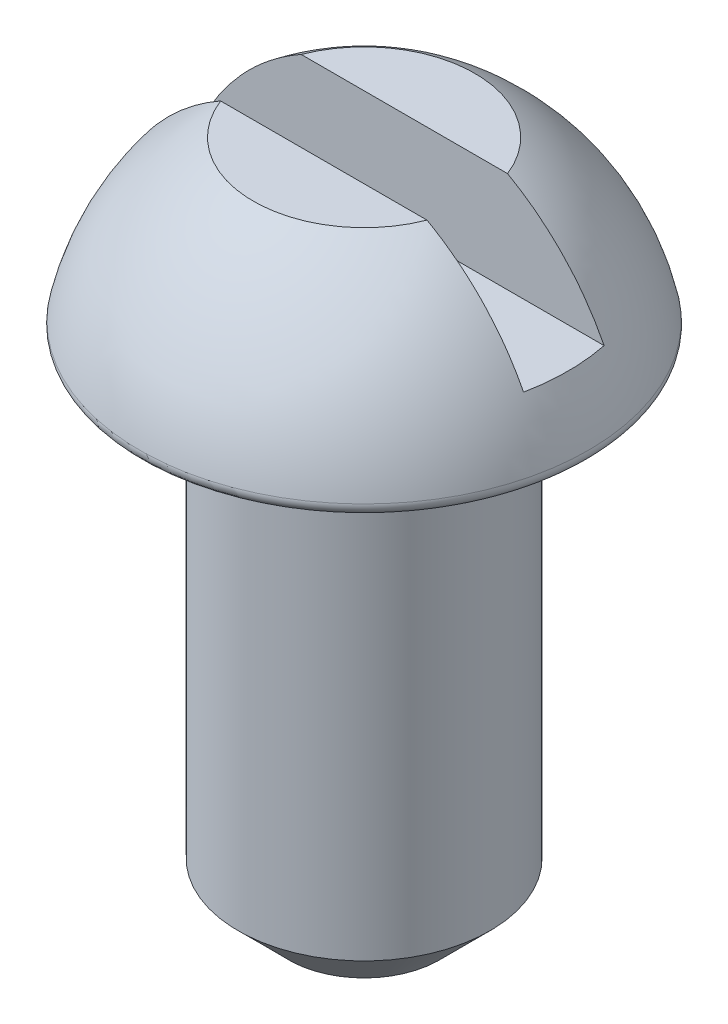
ISO-10303-21;
HEADER;
FILE_DESCRIPTION(('STEP AP214'),'2;1');
FILE_NAME('part.step','',(''),(''),'','','');
FILE_SCHEMA(('AUTOMOTIVE_DESIGN { 1 0 10303 214 1 1 1 1 }'));
ENDSEC;
DATA;
#1=APPLICATION_CONTEXT('core data for automotive mechanical design processes');
#2=APPLICATION_PROTOCOL_DEFINITION('international standard','automotive_design',2000,#1);
#3=PRODUCT_CONTEXT('',#1,'mechanical');
#4=PRODUCT('Part','Part','',(#3));
#5=PRODUCT_RELATED_PRODUCT_CATEGORY('part','',(#4));
#6=PRODUCT_DEFINITION_FORMATION('','',#4);
#7=PRODUCT_DEFINITION_CONTEXT('part definition',#1,'design');
#8=PRODUCT_DEFINITION('design','',#6,#7);
#9=PRODUCT_DEFINITION_SHAPE('','',#8);
#10=(LENGTH_UNIT() NAMED_UNIT(*) SI_UNIT(.MILLI.,.METRE.));
#11=(NAMED_UNIT(*) PLANE_ANGLE_UNIT() SI_UNIT($,.RADIAN.));
#12=(NAMED_UNIT(*) SI_UNIT($,.STERADIAN.) SOLID_ANGLE_UNIT());
#13=UNCERTAINTY_MEASURE_WITH_UNIT(LENGTH_MEASURE(1.E-05),#10,'distance_accuracy_value','');
#14=(GEOMETRIC_REPRESENTATION_CONTEXT(3) GLOBAL_UNCERTAINTY_ASSIGNED_CONTEXT((#13)) GLOBAL_UNIT_ASSIGNED_CONTEXT((#10,
#11,#12)) REPRESENTATION_CONTEXT('',''));
#15=CARTESIAN_POINT('',(0.,0.,0.));
#16=DIRECTION('',(0.,0.,1.));
#17=DIRECTION('',(1.,0.,0.));
#18=AXIS2_PLACEMENT_3D('',#15,#16,#17);
#19=CARTESIAN_POINT('',(0.,6.7,0.));
#20=DIRECTION('',(0.,1.,0.));
#21=DIRECTION('',(0.,0.,1.));
#22=AXIS2_PLACEMENT_3D('',#19,#20,#21);
#23=PLANE('',#22);
#24=DIRECTION('',(-1.,0.,0.));
#25=VECTOR('',#24,1.);
#26=CARTESIAN_POINT('',(-2.5,6.7,-0.4));
#27=LINE('',#26,#25);
#28=CARTESIAN_POINT('',(1.02469507659596,6.7,-0.4));
#29=VERTEX_POINT('',#28);
#30=CARTESIAN_POINT('',(-1.02469507659596,6.7,-0.4));
#31=VERTEX_POINT('',#30);
#32=EDGE_CURVE('E85',#29,#31,#27,.T.);
#33=ORIENTED_EDGE('',*,*,#32,.F.);
#34=CARTESIAN_POINT('',(0.,6.7,0.));
#35=DIRECTION('',(0.,-1.,0.));
#36=DIRECTION('',(0.,0.,-1.));
#37=AXIS2_PLACEMENT_3D('',#34,#35,#36);
#38=CIRCLE('',#37,1.1);
#39=EDGE_CURVE('E92',#31,#29,#38,.T.);
#40=ORIENTED_EDGE('',*,*,#39,.F.);
#41=EDGE_LOOP('',(#33,#40));
#42=FACE_BOUND('',#41,.T.);
#43=ADVANCED_FACE('F31',(#42),#23,.T.);
#44=CARTESIAN_POINT('',(0.75,0.,0.));
#45=DIRECTION('',(0.,-1.,0.));
#46=DIRECTION('',(0.,0.,-1.));
#47=AXIS2_PLACEMENT_3D('',#44,#45,#46);
#48=PLANE('',#47);
#49=CARTESIAN_POINT('',(0.,0.,0.));
#50=DIRECTION('',(0.,-1.,0.));
#51=DIRECTION('',(0.,0.,-1.));
#52=AXIS2_PLACEMENT_3D('',#49,#50,#51);
#53=CIRCLE('',#52,0.75);
#54=CARTESIAN_POINT('',(0.,0.,-0.75));
#55=VERTEX_POINT('',#54);
#56=EDGE_CURVE('E190',#55,#55,#53,.T.);
#57=ORIENTED_EDGE('',*,*,#56,.T.);
#58=EDGE_LOOP('',(#57));
#59=FACE_BOUND('',#58,.T.);
#60=ADVANCED_FACE('F33',(#59),#48,.T.);
#61=DIRECTION('',(1.,0.,0.));
#62=VECTOR('',#61,1.);
#63=CARTESIAN_POINT('',(-2.5,6.7,0.4));
#64=LINE('',#63,#62);
#65=CARTESIAN_POINT('',(-1.02469507659596,6.7,0.4));
#66=VERTEX_POINT('',#65);
#67=CARTESIAN_POINT('',(1.02469507659596,6.7,0.4));
#68=VERTEX_POINT('',#67);
#69=EDGE_CURVE('E76',#66,#68,#64,.T.);
#70=ORIENTED_EDGE('',*,*,#69,.F.);
#71=EDGE_CURVE('E84',#68,#66,#38,.T.);
#72=ORIENTED_EDGE('',*,*,#71,.F.);
#73=EDGE_LOOP('',(#70,#72));
#74=FACE_BOUND('',#73,.T.);
#75=ADVANCED_FACE('F83',(#74),#23,.T.);
#76=CARTESIAN_POINT('',(0.,4.6063677010287,0.));
#77=DIRECTION('',(0.,-1.,0.));
#78=DIRECTION('',(0.,0.,-1.));
#79=AXIS2_PLACEMENT_3D('',#76,#77,#78);
#80=DEGENERATE_TOROIDAL_SURFACE('',#79,0.163412963696708,2.44530335953083,.F.);
#81=CARTESIAN_POINT('',(0.,6.98587906945526,-0.4));
#82=CARTESIAN_POINT('',(-0.0340393368764344,6.98587853967351,-0.4));
#83=CARTESIAN_POINT('',(-0.0680806385514161,6.98484475528946,-0.4));
#84=CARTESIAN_POINT('',(-0.136044239585214,6.98077151304845,-0.4));
#85=CARTESIAN_POINT('',(-0.169966512688445,6.97773163759928,-0.4));
#86=CARTESIAN_POINT('',(-0.27153522568853,6.96581085311434,-0.4));
#87=CARTESIAN_POINT('',(-0.338865413936364,6.95412964589656,-0.4));
#88=CARTESIAN_POINT('',(-0.466840374817371,6.92550258789054,-0.4));
#89=CARTESIAN_POINT('',(-0.527596444172791,6.90903942718526,-0.4));
#90=CARTESIAN_POINT('',(-0.647532675073714,6.87108725806298,-0.4));
#91=CARTESIAN_POINT('',(-0.706712127812102,6.84959603024964,-0.4));
#92=CARTESIAN_POINT('',(-0.881413612269338,6.77797897531619,-0.4));
#93=CARTESIAN_POINT('',(-0.994091656053262,6.72071142271362,-0.4));
#94=CARTESIAN_POINT('',(-1.21116046265258,6.58771713623111,-0.4));
#95=CARTESIAN_POINT('',(-1.31532763151112,6.51162817480206,-0.4));
#96=CARTESIAN_POINT('',(-1.51007306014535,6.34375696307233,-0.4));
#97=CARTESIAN_POINT('',(-1.60065669909113,6.2519809559221,-0.4));
#98=CARTESIAN_POINT('',(-1.76975904942326,6.05061889292395,-0.4));
#99=CARTESIAN_POINT('',(-1.84753891070049,5.94041137940083,-0.4));
#100=CARTESIAN_POINT('',(-1.98362855406321,5.70853234315382,-0.4));
#101=CARTESIAN_POINT('',(-2.04193267740705,5.58685750170236,-0.4));
#102=CARTESIAN_POINT('',(-2.13768245016359,5.33480411787153,-0.4));
#103=CARTESIAN_POINT('',(-2.17501384545688,5.20438215167386,-0.4));
#104=CARTESIAN_POINT('',(-2.22727723132415,4.93913721296156,-0.4));
#105=CARTESIAN_POINT('',(-2.24221099433487,4.80431458955579,-0.4));
#106=CARTESIAN_POINT('',(-2.24926993668814,4.53390653047334,-0.4));
#107=CARTESIAN_POINT('',(-2.24136701233477,4.39832036000992,-0.4));
#108=CARTESIAN_POINT('',(-2.20291218260897,4.13038250775117,-0.4));
#109=CARTESIAN_POINT('',(-2.17235759497554,3.99803121092567,-0.4));
#110=CARTESIAN_POINT('',(-2.08944879829779,3.74031190752979,-0.4));
#111=CARTESIAN_POINT('',(-2.03709019684448,3.61494531379748,-0.4));
#112=CARTESIAN_POINT('',(-1.91207043137878,3.37483254586974,-0.4));
#113=CARTESIAN_POINT('',(-1.83941581092892,3.26008296453046,-0.4));
#114=CARTESIAN_POINT('',(-1.67592713754524,3.04455651568706,-0.4));
#115=CARTESIAN_POINT('',(-1.58511363317758,2.94376407055755,-0.4));
#116=CARTESIAN_POINT('',(-1.38774011243226,2.75884052152001,-0.4));
#117=CARTESIAN_POINT('',(-1.28116673495222,2.67472369811192,-0.4));
#118=CARTESIAN_POINT('',(-1.05560673365431,2.52599968716567,-0.4));
#119=CARTESIAN_POINT('',(-0.936664513213116,2.46132574759789,-0.4));
#120=CARTESIAN_POINT('',(-0.751407583590141,2.38045704661846,-0.4));
#121=CARTESIAN_POINT('',(-0.688506723571064,2.35618923998029,-0.4));
#122=CARTESIAN_POINT('',(-0.560809849612972,2.31333912978168,-0.4));
#123=CARTESIAN_POINT('',(-0.496015087546172,2.29475315964231,-0.4));
#124=CARTESIAN_POINT('',(-0.379774606237006,2.2672698320534,-0.4));
#125=CARTESIAN_POINT('',(-0.328619562875833,2.25713229881349,-0.4));
#126=CARTESIAN_POINT('',(-0.225675136010375,2.24096626324747,-0.4));
#127=CARTESIAN_POINT('',(-0.173886094450959,2.23493563736659,-0.4));
#128=CARTESIAN_POINT('',(-0.0700672977772685,2.22753539788831,-0.4));
#129=CARTESIAN_POINT('',(-0.0180382267348052,2.22615653315214,-0.4));
#130=CARTESIAN_POINT('',(0.0859275445104685,2.22823788363376,-0.4));
#131=CARTESIAN_POINT('',(0.137864226676697,2.23169895789791,-0.4));
#132=CARTESIAN_POINT('',(0.241030783474829,2.24299346691429,-0.4));
#133=CARTESIAN_POINT('',(0.292262684514631,2.25080889246069,-0.4));
#134=CARTESIAN_POINT('',(0.393976932056872,2.27030181276681,-0.4));
#135=CARTESIAN_POINT('',(0.444459169899046,2.2819798617958,-0.4));
#136=CARTESIAN_POINT('',(0.59473099112121,2.32238904149137,-0.4));
#137=CARTESIAN_POINT('',(0.693119997637174,2.35646756311099,-0.4));
#138=CARTESIAN_POINT('',(0.899096302338094,2.44360684666299,-0.4));
#139=CARTESIAN_POINT('',(1.00578918805161,2.4987735589278,-0.4));
#140=CARTESIAN_POINT('',(1.20953068947909,2.62446282577751,-0.4));
#141=CARTESIAN_POINT('',(1.30658922156709,2.69496934777388,-0.4));
#142=CARTESIAN_POINT('',(1.49936637066893,2.85842123448225,-0.4));
#143=CARTESIAN_POINT('',(1.59370796589346,2.95299801985645,-0.4));
#144=CARTESIAN_POINT('',(1.76548574993324,3.15653186078382,-0.4));
#145=CARTESIAN_POINT('',(1.84290866128105,3.26550010366153,-0.400000000000001));
#146=CARTESIAN_POINT('',(1.97954271851369,3.49623547144408,-0.400000000000001));
#147=CARTESIAN_POINT('',(2.03850519368131,3.61814999080063,-0.400000000000001));
#148=CARTESIAN_POINT('',(2.13517330555109,3.87010580424191,-0.400000000000001));
#149=CARTESIAN_POINT('',(2.17288258131227,4.00014570282782,-0.400000000000001));
#150=CARTESIAN_POINT('',(2.2260778635617,4.26505890532003,-0.400000000000001));
#151=CARTESIAN_POINT('',(2.24150400946742,4.39994423454143,-0.400000000000001));
#152=CARTESIAN_POINT('',(2.24950632625439,4.67039525151681,-0.400000000000001));
#153=CARTESIAN_POINT('',(2.24208167112069,4.80596096368854,-0.400000000000001));
#154=CARTESIAN_POINT('',(2.20458033624675,5.07399416240919,-0.400000000000001));
#155=CARTESIAN_POINT('',(2.1744919707742,5.2064600142837,-0.400000000000001));
#156=CARTESIAN_POINT('',(2.09249452405155,5.46446764695252,-0.400000000000001));
#157=CARTESIAN_POINT('',(2.04058386673732,5.59000892689483,-0.400000000000001));
#158=CARTESIAN_POINT('',(1.91641700364703,5.83056049322057,-0.400000000000001));
#159=CARTESIAN_POINT('',(1.84416482376025,5.94557285746997,-0.4));
#160=CARTESIAN_POINT('',(1.68136746837599,6.161775690562,-0.4));
#161=CARTESIAN_POINT('',(1.59082775313349,6.26297027001061,-0.4));
#162=CARTESIAN_POINT('',(1.3941945302079,6.44845601350239,-0.4));
#163=CARTESIAN_POINT('',(1.28813449363465,6.5327826511548,-0.4));
#164=CARTESIAN_POINT('',(1.06314313787397,6.68236095327679,-0.4));
#165=CARTESIAN_POINT('',(0.944198271921474,6.74759226946018,-0.4));
#166=CARTESIAN_POINT('',(0.715299164870537,6.8484629340234,-0.4));
#167=CARTESIAN_POINT('',(0.606656148742176,6.88706715788623,-0.4));
#168=CARTESIAN_POINT('',(0.440416489854844,6.93187809206629,-0.4));
#169=CARTESIAN_POINT('',(0.384530639800243,6.94462456903749,-0.4));
#170=CARTESIAN_POINT('',(0.271892314434502,6.96533379827434,-0.4));
#171=CARTESIAN_POINT('',(0.215140631021158,6.97330068115763,-0.4));
#172=CARTESIAN_POINT('',(0.131860718248229,6.98096128698197,-0.4));
#173=CARTESIAN_POINT('',(0.105518733111905,6.98279980609939,-0.4));
#174=CARTESIAN_POINT('',(0.0527848795277872,6.9852587021146,-0.4));
#175=CARTESIAN_POINT('',(0.0263930303787486,6.98587948023136,-0.4));
#176=CARTESIAN_POINT('',(0.,6.98587906945526,-0.4));
#177=B_SPLINE_CURVE_WITH_KNOTS('',3,(#81,#82,#83,#84,#85,#86,#87,#88,#89,#90,#91,#92,#93,#94,
#95,#96,#97,#98,#99,#100,#101,#102,#103,#104,#105,#106,#107,#108,#109,#110,#111,#112,#113,#114,
#115,#116,#117,#118,#119,#120,#121,#122,#123,#124,#125,#126,#127,#128,#129,#130,#131,#132,#133,
#134,#135,#136,#137,#138,#139,#140,#141,#142,#143,#144,#145,#146,#147,#148,#149,#150,#151,#152,
#153,#154,#155,#156,#157,#158,#159,#160,#161,#162,#163,#164,#165,#166,#167,#168,#169,#170,#171,
#172,#173,#174,#175,#176),.UNSPECIFIED.,.T.,.F.,(4,2,2,2,2,2,2,2,2,2,2,2,2,2,2,2,2,2,2,2,2,2,2,
2,2,2,2,2,2,2,2,2,2,2,2,2,2,2,2,2,2,2,2,2,2,2,2,4),(0.,0.102105086593573,0.204231434307442,
0.408836543729973,0.597454184383686,0.786155238747506,1.16357899186871,1.54892487610662,
1.93411775546429,2.33688174811018,2.73976266361433,3.14481760260444,3.54984048587873,
3.95536201790846,4.36093157680271,4.76658287705932,5.172103543462,5.57716789407863,
5.98257764519323,6.38657920134046,6.58862842465047,6.79054698582301,6.94685600559812,
7.10308414132192,7.25900139632302,7.41494632877032,7.57025102423061,7.7255780148981,
8.03690773063865,8.39584948680008,8.754417877545,9.1532924694866,9.55247897545221,
9.95683187303508,10.3611155146244,10.7664832020485,11.1718655429502,11.5774570479722,
11.9830778509286,12.388618431873,12.794038105856,13.1985959970318,13.6035834353416,
13.9480728882159,14.119880694076,14.2915398056141,14.3707349733162,14.4499040435619),.UNSPECIFIED.);
#178=CARTESIAN_POINT('',(-1.98377782471078,5.7,-0.4));
#179=VERTEX_POINT('',#178);
#180=EDGE_CURVE('E11',#31,#179,#177,.T.);
#181=ORIENTED_EDGE('',*,*,#180,.F.);
#182=ORIENTED_EDGE('',*,*,#39,.T.);
#183=CARTESIAN_POINT('',(1.98377782471078,5.7,-0.400000000000001));
#184=VERTEX_POINT('',#183);
#185=EDGE_CURVE('E35',#184,#29,#177,.T.);
#186=ORIENTED_EDGE('',*,*,#185,.F.);
#187=CARTESIAN_POINT('',(0.,5.7,0.));
#188=DIRECTION('',(0.,1.,0.));
#189=DIRECTION('',(0.,0.,1.));
#190=AXIS2_PLACEMENT_3D('',#187,#188,#189);
#191=CIRCLE('',#190,2.02370315456942);
#192=CARTESIAN_POINT('',(1.98377782471078,5.7,0.4));
#193=VERTEX_POINT('',#192);
#194=EDGE_CURVE('E104',#184,#193,#191,.F.);
#195=ORIENTED_EDGE('',*,*,#194,.T.);
#196=CARTESIAN_POINT('',(0.,6.98587906945526,0.4));
#197=CARTESIAN_POINT('',(0.0340393368764344,6.98587853967351,0.4));
#198=CARTESIAN_POINT('',(0.0680806385514161,6.98484475528946,0.4));
#199=CARTESIAN_POINT('',(0.136044239585214,6.98077151304845,0.4));
#200=CARTESIAN_POINT('',(0.169966512688445,6.97773163759928,0.4));
#201=CARTESIAN_POINT('',(0.27153522568853,6.96581085311434,0.4));
#202=CARTESIAN_POINT('',(0.338865413936364,6.95412964589656,0.4));
#203=CARTESIAN_POINT('',(0.466840374817371,6.92550258789054,0.4));
#204=CARTESIAN_POINT('',(0.527596444172791,6.90903942718526,0.4));
#205=CARTESIAN_POINT('',(0.647532675073714,6.87108725806298,0.4));
#206=CARTESIAN_POINT('',(0.706712127812102,6.84959603024964,0.4));
#207=CARTESIAN_POINT('',(0.881413612269338,6.77797897531619,0.4));
#208=CARTESIAN_POINT('',(0.994091656053262,6.72071142271362,0.4));
#209=CARTESIAN_POINT('',(1.21116046265258,6.58771713623111,0.4));
#210=CARTESIAN_POINT('',(1.31532763151112,6.51162817480206,0.4));
#211=CARTESIAN_POINT('',(1.51007306014535,6.34375696307233,0.4));
#212=CARTESIAN_POINT('',(1.60065669909113,6.2519809559221,0.4));
#213=CARTESIAN_POINT('',(1.76975904942326,6.05061889292395,0.4));
#214=CARTESIAN_POINT('',(1.84753891070049,5.94041137940083,0.4));
#215=CARTESIAN_POINT('',(1.98362855406321,5.70853234315382,0.4));
#216=CARTESIAN_POINT('',(2.04193267740705,5.58685750170236,0.4));
#217=CARTESIAN_POINT('',(2.13768245016359,5.33480411787153,0.4));
#218=CARTESIAN_POINT('',(2.17501384545688,5.20438215167386,0.4));
#219=CARTESIAN_POINT('',(2.22727723132415,4.93913721296156,0.4));
#220=CARTESIAN_POINT('',(2.24221099433487,4.80431458955579,0.4));
#221=CARTESIAN_POINT('',(2.24926993668814,4.53390653047334,0.4));
#222=CARTESIAN_POINT('',(2.24136701233477,4.39832036000992,0.4));
#223=CARTESIAN_POINT('',(2.20291218260897,4.13038250775117,0.4));
#224=CARTESIAN_POINT('',(2.17235759497554,3.99803121092567,0.4));
#225=CARTESIAN_POINT('',(2.08944879829779,3.74031190752979,0.4));
#226=CARTESIAN_POINT('',(2.03709019684448,3.61494531379748,0.4));
#227=CARTESIAN_POINT('',(1.91207043137878,3.37483254586974,0.4));
#228=CARTESIAN_POINT('',(1.83941581092892,3.26008296453046,0.4));
#229=CARTESIAN_POINT('',(1.67592713754524,3.04455651568706,0.4));
#230=CARTESIAN_POINT('',(1.58511363317758,2.94376407055755,0.4));
#231=CARTESIAN_POINT('',(1.38774011243226,2.75884052152001,0.4));
#232=CARTESIAN_POINT('',(1.28116673495222,2.67472369811192,0.4));
#233=CARTESIAN_POINT('',(1.05560673365431,2.52599968716567,0.4));
#234=CARTESIAN_POINT('',(0.936664513213116,2.46132574759789,0.4));
#235=CARTESIAN_POINT('',(0.751407583590142,2.38045704661846,0.4));
#236=CARTESIAN_POINT('',(0.688506723571066,2.3561892399803,0.4));
#237=CARTESIAN_POINT('',(0.560809849612973,2.31333912978168,0.4));
#238=CARTESIAN_POINT('',(0.496015087546172,2.29475315964231,0.4));
#239=CARTESIAN_POINT('',(0.379774606237006,2.2672698320534,0.4));
#240=CARTESIAN_POINT('',(0.328619562875834,2.25713229881349,0.4));
#241=CARTESIAN_POINT('',(0.225675136010376,2.24096626324747,0.4));
#242=CARTESIAN_POINT('',(0.17388609445096,2.23493563736659,0.4));
#243=CARTESIAN_POINT('',(0.0700672977772695,2.22753539788831,0.4));
#244=CARTESIAN_POINT('',(0.0180382267348061,2.22615653315214,0.4));
#245=CARTESIAN_POINT('',(-0.0859275445104677,2.22823788363376,0.4));
#246=CARTESIAN_POINT('',(-0.137864226676696,2.23169895789791,0.4));
#247=CARTESIAN_POINT('',(-0.241030783474828,2.24299346691428,0.4));
#248=CARTESIAN_POINT('',(-0.29226268451463,2.25080889246069,0.4));
#249=CARTESIAN_POINT('',(-0.39397693205687,2.27030181276681,0.4));
#250=CARTESIAN_POINT('',(-0.444459169899045,2.2819798617958,0.4));
#251=CARTESIAN_POINT('',(-0.594730991121208,2.32238904149137,0.4));
#252=CARTESIAN_POINT('',(-0.693119997637172,2.35646756311099,0.4));
#253=CARTESIAN_POINT('',(-0.899096302338093,2.44360684666299,0.4));
#254=CARTESIAN_POINT('',(-1.00578918805161,2.4987735589278,0.4));
#255=CARTESIAN_POINT('',(-1.20953068947909,2.62446282577751,0.4));
#256=CARTESIAN_POINT('',(-1.30658922156709,2.69496934777388,0.4));
#257=CARTESIAN_POINT('',(-1.49936637066893,2.85842123448225,0.4));
#258=CARTESIAN_POINT('',(-1.59370796589346,2.95299801985645,0.4));
#259=CARTESIAN_POINT('',(-1.76548574993323,3.15653186078382,0.4));
#260=CARTESIAN_POINT('',(-1.84290866128105,3.26550010366153,0.4));
#261=CARTESIAN_POINT('',(-1.97954271851369,3.49623547144408,0.4));
#262=CARTESIAN_POINT('',(-2.03850519368131,3.61814999080063,0.4));
#263=CARTESIAN_POINT('',(-2.13517330555109,3.87010580424191,0.4));
#264=CARTESIAN_POINT('',(-2.17288258131227,4.00014570282782,0.4));
#265=CARTESIAN_POINT('',(-2.2260778635617,4.26505890532003,0.4));
#266=CARTESIAN_POINT('',(-2.24150400946742,4.39994423454143,0.4));
#267=CARTESIAN_POINT('',(-2.24950632625439,4.6703952515168,0.4));
#268=CARTESIAN_POINT('',(-2.24208167112069,4.80596096368853,0.4));
#269=CARTESIAN_POINT('',(-2.20458033624675,5.07399416240919,0.4));
#270=CARTESIAN_POINT('',(-2.1744919707742,5.20646001428369,0.4));
#271=CARTESIAN_POINT('',(-2.09249452405155,5.46446764695252,0.4));
#272=CARTESIAN_POINT('',(-2.04058386673732,5.59000892689483,0.4));
#273=CARTESIAN_POINT('',(-1.91641700364703,5.83056049322057,0.4));
#274=CARTESIAN_POINT('',(-1.84416482376025,5.94557285746997,0.4));
#275=CARTESIAN_POINT('',(-1.68136746837599,6.161775690562,0.4));
#276=CARTESIAN_POINT('',(-1.59082775313349,6.26297027001061,0.4));
#277=CARTESIAN_POINT('',(-1.3941945302079,6.44845601350238,0.4));
#278=CARTESIAN_POINT('',(-1.28813449363465,6.5327826511548,0.4));
#279=CARTESIAN_POINT('',(-1.06314313787397,6.68236095327679,0.4));
#280=CARTESIAN_POINT('',(-0.944198271921476,6.74759226946018,0.4));
#281=CARTESIAN_POINT('',(-0.715299164870538,6.8484629340234,0.4));
#282=CARTESIAN_POINT('',(-0.606656148742176,6.88706715788623,0.4));
#283=CARTESIAN_POINT('',(-0.440416489854844,6.93187809206629,0.4));
#284=CARTESIAN_POINT('',(-0.384530639800243,6.94462456903749,0.4));
#285=CARTESIAN_POINT('',(-0.271892314434503,6.96533379827434,0.4));
#286=CARTESIAN_POINT('',(-0.215140631021159,6.97330068115763,0.4));
#287=CARTESIAN_POINT('',(-0.13186071824823,6.98096128698197,0.4));
#288=CARTESIAN_POINT('',(-0.105518733111907,6.98279980609939,0.4));
#289=CARTESIAN_POINT('',(-0.0527848795277883,6.9852587021146,0.4));
#290=CARTESIAN_POINT('',(-0.0263930303787491,6.98587948023136,0.4));
#291=CARTESIAN_POINT('',(0.,6.98587906945526,0.4));
#292=B_SPLINE_CURVE_WITH_KNOTS('',3,(#196,#197,#198,#199,#200,#201,#202,#203,#204,#205,#206,
#207,#208,#209,#210,#211,#212,#213,#214,#215,#216,#217,#218,#219,#220,#221,#222,#223,#224,#225,
#226,#227,#228,#229,#230,#231,#232,#233,#234,#235,#236,#237,#238,#239,#240,#241,#242,#243,#244,
#245,#246,#247,#248,#249,#250,#251,#252,#253,#254,#255,#256,#257,#258,#259,#260,#261,#262,#263,
#264,#265,#266,#267,#268,#269,#270,#271,#272,#273,#274,#275,#276,#277,#278,#279,#280,#281,#282,
#283,#284,#285,#286,#287,#288,#289,#290,#291),.UNSPECIFIED.,.T.,.F.,(4,2,2,2,2,2,2,2,2,2,2,2,2,
2,2,2,2,2,2,2,2,2,2,2,2,2,2,2,2,2,2,2,2,2,2,2,2,2,2,2,2,2,2,2,2,2,2,4),(0.,0.102105086593573,
0.204231434307442,0.408836543729973,0.597454184383686,0.786155238747506,1.16357899186871,
1.54892487610662,1.93411775546429,2.33688174811018,2.73976266361433,3.14481760260444,
3.54984048587873,3.95536201790846,4.36093157680271,4.76658287705932,5.172103543462,
5.57716789407863,5.98257764519323,6.38657920134046,6.58862842465047,6.79054698582301,
6.94685600559812,7.10308414132192,7.25900139632302,7.41494632877032,7.5702510242306,
7.7255780148981,8.03690773063865,8.39584948680008,8.754417877545,9.1532924694866,
9.55247897545221,9.95683187303508,10.3611155146244,10.7664832020485,11.1718655429502,
11.5774570479722,11.9830778509286,12.388618431873,12.794038105856,13.1985959970318,
13.6035834353416,13.9480728882159,14.119880694076,14.2915398056141,14.3707349733162,
14.4499040435619),.UNSPECIFIED.);
#293=EDGE_CURVE('E80',#68,#193,#292,.T.);
#294=ORIENTED_EDGE('',*,*,#293,.F.);
#295=ORIENTED_EDGE('',*,*,#71,.T.);
#296=CARTESIAN_POINT('',(-1.98377782471078,5.7,0.4));
#297=VERTEX_POINT('',#296);
#298=EDGE_CURVE('E44',#297,#66,#292,.T.);
#299=ORIENTED_EDGE('',*,*,#298,.F.);
#300=EDGE_CURVE('E56',#297,#179,#191,.F.);
#301=ORIENTED_EDGE('',*,*,#300,.T.);
#302=EDGE_LOOP('',(#181,#182,#186,#195,#294,#295,#299,#301));
#303=FACE_BOUND('',#302,.T.);
#304=CARTESIAN_POINT('',(0.,5.12104769504402,0.));
#305=DIRECTION('',(0.,-1.,0.));
#306=DIRECTION('',(0.,0.,-1.));
#307=AXIS2_PLACEMENT_3D('',#304,#305,#306);
#308=CIRCLE('',#307,2.22711271570796);
#309=CARTESIAN_POINT('',(0.,5.12104769504402,-2.22711271570796));
#310=VERTEX_POINT('',#309);
#311=EDGE_CURVE('E95',#310,#310,#308,.F.);
#312=ORIENTED_EDGE('',*,*,#311,.T.);
#313=EDGE_LOOP('',(#312));
#314=FACE_BOUND('',#313,.T.);
#315=ADVANCED_FACE('F88',(#303,#314),#80,.F.);
#316=CARTESIAN_POINT('',(2.25,5.,0.));
#317=DIRECTION('',(0.,-1.,0.));
#318=DIRECTION('',(0.,0.,-1.));
#319=AXIS2_PLACEMENT_3D('',#316,#317,#318);
#320=PLANE('',#319);
#321=CARTESIAN_POINT('',(0.,5.,0.));
#322=DIRECTION('',(0.,-1.,0.));
#323=DIRECTION('',(0.,0.,-1.));
#324=AXIS2_PLACEMENT_3D('',#321,#322,#323);
#325=CIRCLE('',#324,2.12935283368402);
#326=CARTESIAN_POINT('',(0.,5.,-2.12935283368402));
#327=VERTEX_POINT('',#326);
#328=EDGE_CURVE('E91',#327,#327,#325,.T.);
#329=ORIENTED_EDGE('',*,*,#328,.T.);
#330=EDGE_LOOP('',(#329));
#331=FACE_BOUND('',#330,.T.);
#332=CARTESIAN_POINT('',(0.,5.,0.));
#333=DIRECTION('',(0.,-1.,0.));
#334=DIRECTION('',(0.,0.,-1.));
#335=AXIS2_PLACEMENT_3D('',#332,#333,#334);
#336=CIRCLE('',#335,1.25);
#337=CARTESIAN_POINT('',(0.,5.,-1.25));
#338=VERTEX_POINT('',#337);
#339=EDGE_CURVE('E98',#338,#338,#336,.T.);
#340=ORIENTED_EDGE('',*,*,#339,.F.);
#341=EDGE_LOOP('',(#340));
#342=FACE_BOUND('',#341,.T.);
#343=ADVANCED_FACE('F127',(#331,#342),#320,.T.);
#344=CARTESIAN_POINT('',(0.,0.,0.));
#345=DIRECTION('',(0.,-1.,0.));
#346=DIRECTION('',(0.,0.,-1.));
#347=AXIS2_PLACEMENT_3D('',#344,#345,#346);
#348=CYLINDRICAL_SURFACE('',#347,1.25);
#349=ORIENTED_EDGE('',*,*,#339,.T.);
#350=EDGE_LOOP('',(#349));
#351=FACE_BOUND('',#350,.T.);
#352=CARTESIAN_POINT('',(0.,0.500000000000003,0.));
#353=DIRECTION('',(0.,-1.,0.));
#354=DIRECTION('',(0.,0.,-1.));
#355=AXIS2_PLACEMENT_3D('',#352,#353,#354);
#356=CIRCLE('',#355,1.25);
#357=CARTESIAN_POINT('',(0.,0.500000000000003,-1.25));
#358=VERTEX_POINT('',#357);
#359=EDGE_CURVE('E196',#358,#358,#356,.T.);
#360=ORIENTED_EDGE('',*,*,#359,.F.);
#361=EDGE_LOOP('',(#360));
#362=FACE_BOUND('',#361,.T.);
#363=ADVANCED_FACE('F124',(#351,#362),#348,.T.);
#364=CARTESIAN_POINT('',(0.,0.,0.));
#365=DIRECTION('',(0.,1.,0.));
#366=DIRECTION('',(0.,0.,1.));
#367=AXIS2_PLACEMENT_3D('',#364,#365,#366);
#368=CONICAL_SURFACE('',#367,0.75,0.785398163397446);
#369=ORIENTED_EDGE('',*,*,#359,.T.);
#370=EDGE_LOOP('',(#369));
#371=FACE_BOUND('',#370,.T.);
#372=ORIENTED_EDGE('',*,*,#56,.F.);
#373=EDGE_LOOP('',(#372));
#374=FACE_BOUND('',#373,.T.);
#375=ADVANCED_FACE('F120',(#371,#374),#368,.T.);
#376=CARTESIAN_POINT('',(0.,5.1,0.));
#377=DIRECTION('',(0.,-1.,0.));
#378=DIRECTION('',(0.,0.,-1.));
#379=AXIS2_PLACEMENT_3D('',#376,#377,#378);
#380=TOROIDAL_SURFACE('',#379,2.12935283368402,0.1);
#381=ORIENTED_EDGE('',*,*,#311,.F.);
#382=EDGE_LOOP('',(#381));
#383=FACE_BOUND('',#382,.T.);
#384=ORIENTED_EDGE('',*,*,#328,.F.);
#385=EDGE_LOOP('',(#384));
#386=FACE_BOUND('',#385,.T.);
#387=ADVANCED_FACE('F117',(#383,#386),#380,.T.);
#388=CARTESIAN_POINT('',(-2.5,5.7,-0.4));
#389=DIRECTION('',(0.,0.,-1.));
#390=DIRECTION('',(-1.,0.,0.));
#391=AXIS2_PLACEMENT_3D('',#388,#389,#390);
#392=PLANE('',#391);
#393=ORIENTED_EDGE('',*,*,#180,.T.);
#394=DIRECTION('',(-1.,0.,0.));
#395=VECTOR('',#394,1.);
#396=CARTESIAN_POINT('',(-2.5,5.7,-0.4));
#397=LINE('',#396,#395);
#398=EDGE_CURVE('E187',#184,#179,#397,.T.);
#399=ORIENTED_EDGE('',*,*,#398,.F.);
#400=ORIENTED_EDGE('',*,*,#185,.T.);
#401=ORIENTED_EDGE('',*,*,#32,.T.);
#402=EDGE_LOOP('',(#393,#399,#400,#401));
#403=FACE_BOUND('',#402,.T.);
#404=ADVANCED_FACE('F114',(#403),#392,.F.);
#405=CARTESIAN_POINT('',(-2.5,5.7,0.4));
#406=DIRECTION('',(0.,0.,1.));
#407=DIRECTION('',(1.,0.,0.));
#408=AXIS2_PLACEMENT_3D('',#405,#406,#407);
#409=PLANE('',#408);
#410=ORIENTED_EDGE('',*,*,#293,.T.);
#411=DIRECTION('',(1.,0.,0.));
#412=VECTOR('',#411,1.);
#413=CARTESIAN_POINT('',(-2.5,5.7,0.4));
#414=LINE('',#413,#412);
#415=EDGE_CURVE('E51',#297,#193,#414,.T.);
#416=ORIENTED_EDGE('',*,*,#415,.F.);
#417=ORIENTED_EDGE('',*,*,#298,.T.);
#418=ORIENTED_EDGE('',*,*,#69,.T.);
#419=EDGE_LOOP('',(#410,#416,#417,#418));
#420=FACE_BOUND('',#419,.T.);
#421=ADVANCED_FACE('F75',(#420),#409,.F.);
#422=CARTESIAN_POINT('',(-2.5,5.7,-0.4));
#423=DIRECTION('',(0.,1.,0.));
#424=DIRECTION('',(0.,0.,1.));
#425=AXIS2_PLACEMENT_3D('',#422,#423,#424);
#426=PLANE('',#425);
#427=ORIENTED_EDGE('',*,*,#415,.T.);
#428=ORIENTED_EDGE('',*,*,#194,.F.);
#429=ORIENTED_EDGE('',*,*,#398,.T.);
#430=ORIENTED_EDGE('',*,*,#300,.F.);
#431=EDGE_LOOP('',(#427,#428,#429,#430));
#432=FACE_BOUND('',#431,.T.);
#433=ADVANCED_FACE('F113',(#432),#426,.T.);
#434=CLOSED_SHELL('',(#43,#60,#75,#315,#343,#363,#375,#387,#404,#421,#433));
#435=MANIFOLD_SOLID_BREP('B2',#434);
#436=ADVANCED_BREP_SHAPE_REPRESENTATION('',(#18,#435),#14);
#437=SHAPE_DEFINITION_REPRESENTATION(#9,#436);
ENDSEC;
END-ISO-10303-21;
